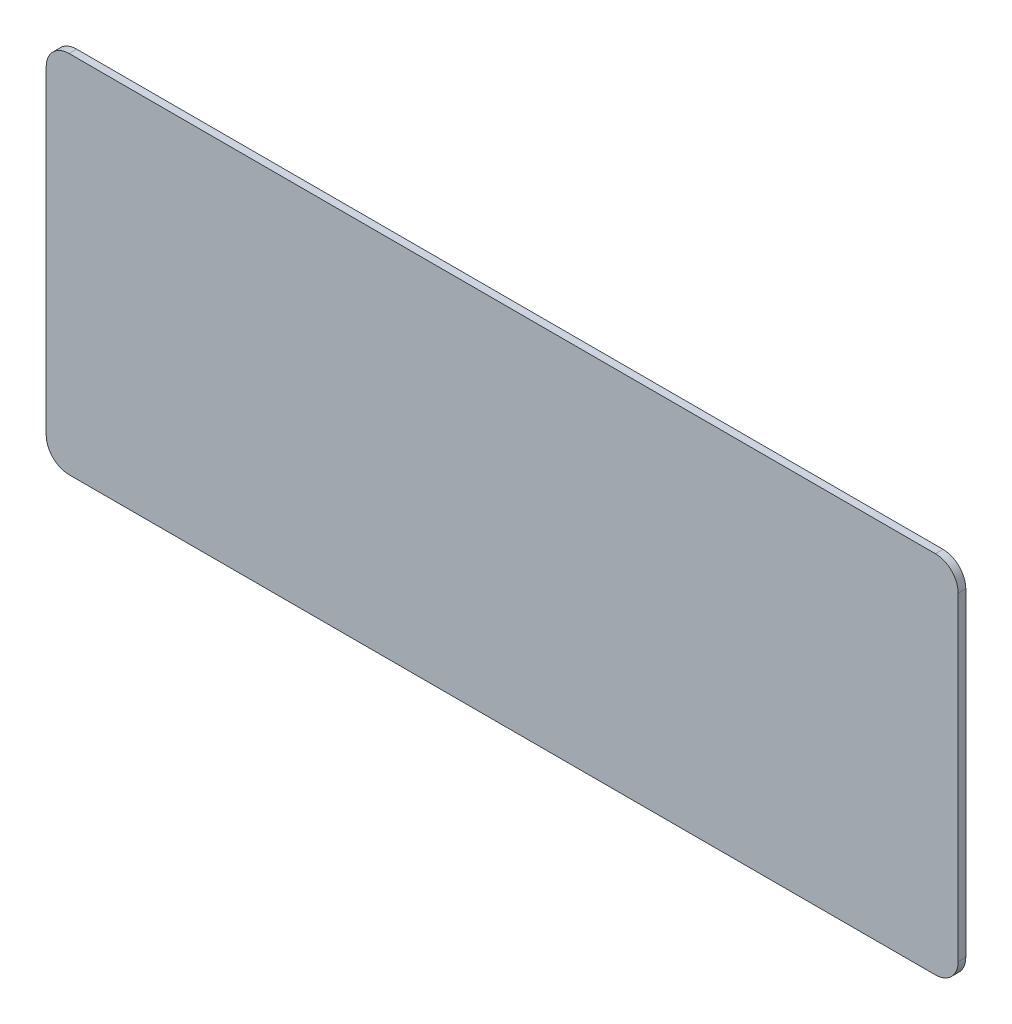
ISO-10303-21;
HEADER;
FILE_DESCRIPTION(('STEP AP214'),'2;1');
FILE_NAME('part.step','',(''),(''),'','','');
FILE_SCHEMA(('AUTOMOTIVE_DESIGN { 1 0 10303 214 1 1 1 1 }'));
ENDSEC;
DATA;
#1=APPLICATION_CONTEXT('core data for automotive mechanical design processes');
#2=APPLICATION_PROTOCOL_DEFINITION('international standard','automotive_design',2000,#1);
#3=PRODUCT_CONTEXT('',#1,'mechanical');
#4=PRODUCT('Part','Part','',(#3));
#5=PRODUCT_RELATED_PRODUCT_CATEGORY('part','',(#4));
#6=PRODUCT_DEFINITION_FORMATION('','',#4);
#7=PRODUCT_DEFINITION_CONTEXT('part definition',#1,'design');
#8=PRODUCT_DEFINITION('design','',#6,#7);
#9=PRODUCT_DEFINITION_SHAPE('','',#8);
#10=(LENGTH_UNIT() NAMED_UNIT(*) SI_UNIT(.MILLI.,.METRE.));
#11=(NAMED_UNIT(*) PLANE_ANGLE_UNIT() SI_UNIT($,.RADIAN.));
#12=(NAMED_UNIT(*) SI_UNIT($,.STERADIAN.) SOLID_ANGLE_UNIT());
#13=UNCERTAINTY_MEASURE_WITH_UNIT(LENGTH_MEASURE(1.E-05),#10,'distance_accuracy_value','');
#14=(GEOMETRIC_REPRESENTATION_CONTEXT(3) GLOBAL_UNCERTAINTY_ASSIGNED_CONTEXT((#13)) GLOBAL_UNIT_ASSIGNED_CONTEXT((#10,
#11,#12)) REPRESENTATION_CONTEXT('',''));
#15=CARTESIAN_POINT('',(0.,0.,0.));
#16=DIRECTION('',(0.,0.,1.));
#17=DIRECTION('',(1.,0.,0.));
#18=AXIS2_PLACEMENT_3D('',#15,#16,#17);
#19=CARTESIAN_POINT('',(-51.9401445531972,-20.8055695293981,1.));
#20=DIRECTION('',(0.,0.,-1.));
#21=DIRECTION('',(-1.,0.,0.));
#22=AXIS2_PLACEMENT_3D('',#19,#20,#21);
#23=CYLINDRICAL_SURFACE('',#22,3.);
#24=CARTESIAN_POINT('',(-51.9401445531972,-20.8055695293981,0.));
#25=DIRECTION('',(0.,0.,1.));
#26=DIRECTION('',(1.,0.,0.));
#27=AXIS2_PLACEMENT_3D('',#24,#25,#26);
#28=CIRCLE('',#27,3.);
#29=CARTESIAN_POINT('',(-54.9401445531972,-20.8055695293981,0.));
#30=VERTEX_POINT('',#29);
#31=CARTESIAN_POINT('',(-51.9401445531972,-23.8055695293981,0.));
#32=VERTEX_POINT('',#31);
#33=EDGE_CURVE('E132',#30,#32,#28,.T.);
#34=ORIENTED_EDGE('',*,*,#33,.T.);
#35=DIRECTION('',(0.,0.,-1.));
#36=VECTOR('',#35,1.);
#37=CARTESIAN_POINT('',(-51.9401445531972,-23.8055695293981,1.));
#38=LINE('',#37,#36);
#39=CARTESIAN_POINT('',(-51.9401445531972,-23.8055695293981,1.));
#40=VERTEX_POINT('',#39);
#41=EDGE_CURVE('E11',#40,#32,#38,.T.);
#42=ORIENTED_EDGE('',*,*,#41,.F.);
#43=CARTESIAN_POINT('',(-51.9401445531972,-20.8055695293981,1.));
#44=DIRECTION('',(0.,0.,1.));
#45=DIRECTION('',(1.,0.,0.));
#46=AXIS2_PLACEMENT_3D('',#43,#44,#45);
#47=CIRCLE('',#46,3.);
#48=CARTESIAN_POINT('',(-54.9401445531972,-20.8055695293981,1.));
#49=VERTEX_POINT('',#48);
#50=EDGE_CURVE('E148',#49,#40,#47,.T.);
#51=ORIENTED_EDGE('',*,*,#50,.F.);
#52=DIRECTION('',(0.,0.,-1.));
#53=VECTOR('',#52,1.);
#54=CARTESIAN_POINT('',(-54.9401445531972,-20.8055695293981,1.));
#55=LINE('',#54,#53);
#56=EDGE_CURVE('E128',#49,#30,#55,.T.);
#57=ORIENTED_EDGE('',*,*,#56,.T.);
#58=EDGE_LOOP('',(#34,#42,#51,#57));
#59=FACE_BOUND('',#58,.T.);
#60=ADVANCED_FACE('F35',(#59),#23,.T.);
#61=CARTESIAN_POINT('',(-51.9401445531972,-23.8055695293981,1.));
#62=DIRECTION('',(0.,1.,0.));
#63=DIRECTION('',(0.,0.,1.));
#64=AXIS2_PLACEMENT_3D('',#61,#62,#63);
#65=PLANE('',#64);
#66=DIRECTION('',(1.,0.,0.));
#67=VECTOR('',#66,1.);
#68=CARTESIAN_POINT('',(-51.9401445531972,-23.8055695293981,0.));
#69=LINE('',#68,#67);
#70=CARTESIAN_POINT('',(62.0598554468028,-23.8055695293981,0.));
#71=VERTEX_POINT('',#70);
#72=EDGE_CURVE('E135',#32,#71,#69,.T.);
#73=ORIENTED_EDGE('',*,*,#72,.T.);
#74=DIRECTION('',(0.,0.,-1.));
#75=VECTOR('',#74,1.);
#76=CARTESIAN_POINT('',(62.0598554468028,-23.8055695293981,1.));
#77=LINE('',#76,#75);
#78=CARTESIAN_POINT('',(62.0598554468028,-23.8055695293981,1.));
#79=VERTEX_POINT('',#78);
#80=EDGE_CURVE('E43',#79,#71,#77,.T.);
#81=ORIENTED_EDGE('',*,*,#80,.F.);
#82=DIRECTION('',(1.,0.,0.));
#83=VECTOR('',#82,1.);
#84=CARTESIAN_POINT('',(-51.9401445531972,-23.8055695293981,1.));
#85=LINE('',#84,#83);
#86=EDGE_CURVE('E92',#40,#79,#85,.T.);
#87=ORIENTED_EDGE('',*,*,#86,.F.);
#88=ORIENTED_EDGE('',*,*,#41,.T.);
#89=EDGE_LOOP('',(#73,#81,#87,#88));
#90=FACE_BOUND('',#89,.T.);
#91=ADVANCED_FACE('F180',(#90),#65,.F.);
#92=CARTESIAN_POINT('',(62.0598554468028,-20.8055695293981,1.));
#93=DIRECTION('',(0.,0.,-1.));
#94=DIRECTION('',(-1.,0.,0.));
#95=AXIS2_PLACEMENT_3D('',#92,#93,#94);
#96=CYLINDRICAL_SURFACE('',#95,3.);
#97=CARTESIAN_POINT('',(62.0598554468028,-20.8055695293981,0.));
#98=DIRECTION('',(0.,0.,1.));
#99=DIRECTION('',(1.,0.,0.));
#100=AXIS2_PLACEMENT_3D('',#97,#98,#99);
#101=CIRCLE('',#100,3.);
#102=CARTESIAN_POINT('',(65.0598554468028,-20.8055695293981,0.));
#103=VERTEX_POINT('',#102);
#104=EDGE_CURVE('E137',#71,#103,#101,.T.);
#105=ORIENTED_EDGE('',*,*,#104,.T.);
#106=DIRECTION('',(0.,0.,-1.));
#107=VECTOR('',#106,1.);
#108=CARTESIAN_POINT('',(65.0598554468028,-20.8055695293981,1.));
#109=LINE('',#108,#107);
#110=CARTESIAN_POINT('',(65.0598554468028,-20.8055695293981,1.));
#111=VERTEX_POINT('',#110);
#112=EDGE_CURVE('E155',#111,#103,#109,.T.);
#113=ORIENTED_EDGE('',*,*,#112,.F.);
#114=CARTESIAN_POINT('',(62.0598554468028,-20.8055695293981,1.));
#115=DIRECTION('',(0.,0.,1.));
#116=DIRECTION('',(1.,0.,0.));
#117=AXIS2_PLACEMENT_3D('',#114,#115,#116);
#118=CIRCLE('',#117,3.);
#119=EDGE_CURVE('E163',#79,#111,#118,.T.);
#120=ORIENTED_EDGE('',*,*,#119,.F.);
#121=ORIENTED_EDGE('',*,*,#80,.T.);
#122=EDGE_LOOP('',(#105,#113,#120,#121));
#123=FACE_BOUND('',#122,.T.);
#124=ADVANCED_FACE('F161',(#123),#96,.T.);
#125=CARTESIAN_POINT('',(65.0598554468031,0.194430470601938,1.));
#126=DIRECTION('',(-1.,0.,0.));
#127=DIRECTION('',(0.,-1.,0.));
#128=AXIS2_PLACEMENT_3D('',#125,#126,#127);
#129=PLANE('',#128);
#130=DIRECTION('',(0.,1.,0.));
#131=VECTOR('',#130,1.);
#132=CARTESIAN_POINT('',(65.0598554468031,0.194430470601938,0.));
#133=LINE('',#132,#131);
#134=CARTESIAN_POINT('',(65.0598554468028,21.1944304706019,0.));
#135=VERTEX_POINT('',#134);
#136=EDGE_CURVE('E140',#103,#135,#133,.T.);
#137=ORIENTED_EDGE('',*,*,#136,.T.);
#138=DIRECTION('',(0.,0.,-1.));
#139=VECTOR('',#138,1.);
#140=CARTESIAN_POINT('',(65.0598554468028,21.1944304706019,1.));
#141=LINE('',#140,#139);
#142=CARTESIAN_POINT('',(65.0598554468028,21.1944304706019,1.));
#143=VERTEX_POINT('',#142);
#144=EDGE_CURVE('E152',#143,#135,#141,.T.);
#145=ORIENTED_EDGE('',*,*,#144,.F.);
#146=DIRECTION('',(0.,1.,0.));
#147=VECTOR('',#146,1.);
#148=CARTESIAN_POINT('',(65.0598554468028,-20.8055695293981,1.));
#149=LINE('',#148,#147);
#150=EDGE_CURVE('E172',#111,#143,#149,.T.);
#151=ORIENTED_EDGE('',*,*,#150,.F.);
#152=ORIENTED_EDGE('',*,*,#112,.T.);
#153=EDGE_LOOP('',(#137,#145,#151,#152));
#154=FACE_BOUND('',#153,.T.);
#155=ADVANCED_FACE('F168',(#154),#129,.F.);
#156=CARTESIAN_POINT('',(62.0598554468028,21.1944304706019,1.));
#157=DIRECTION('',(0.,0.,-1.));
#158=DIRECTION('',(-1.,0.,0.));
#159=AXIS2_PLACEMENT_3D('',#156,#157,#158);
#160=CYLINDRICAL_SURFACE('',#159,3.);
#161=CARTESIAN_POINT('',(62.0598554468028,21.1944304706019,0.));
#162=DIRECTION('',(0.,0.,1.));
#163=DIRECTION('',(1.,0.,0.));
#164=AXIS2_PLACEMENT_3D('',#161,#162,#163);
#165=CIRCLE('',#164,3.);
#166=CARTESIAN_POINT('',(62.0598554468028,24.1944304706019,0.));
#167=VERTEX_POINT('',#166);
#168=EDGE_CURVE('E142',#135,#167,#165,.T.);
#169=ORIENTED_EDGE('',*,*,#168,.T.);
#170=DIRECTION('',(0.,0.,-1.));
#171=VECTOR('',#170,1.);
#172=CARTESIAN_POINT('',(62.0598554468028,24.1944304706019,1.));
#173=LINE('',#172,#171);
#174=CARTESIAN_POINT('',(62.0598554468028,24.1944304706019,1.));
#175=VERTEX_POINT('',#174);
#176=EDGE_CURVE('E123',#175,#167,#173,.T.);
#177=ORIENTED_EDGE('',*,*,#176,.F.);
#178=CARTESIAN_POINT('',(62.0598554468028,21.1944304706019,1.));
#179=DIRECTION('',(0.,0.,1.));
#180=DIRECTION('',(1.,0.,0.));
#181=AXIS2_PLACEMENT_3D('',#178,#179,#180);
#182=CIRCLE('',#181,3.);
#183=EDGE_CURVE('E112',#143,#175,#182,.T.);
#184=ORIENTED_EDGE('',*,*,#183,.F.);
#185=ORIENTED_EDGE('',*,*,#144,.T.);
#186=EDGE_LOOP('',(#169,#177,#184,#185));
#187=FACE_BOUND('',#186,.T.);
#188=ADVANCED_FACE('F171',(#187),#160,.T.);
#189=CARTESIAN_POINT('',(62.0598554468028,24.1944304706019,1.));
#190=DIRECTION('',(0.,-1.,0.));
#191=DIRECTION('',(0.,0.,-1.));
#192=AXIS2_PLACEMENT_3D('',#189,#190,#191);
#193=PLANE('',#192);
#194=DIRECTION('',(-1.,0.,0.));
#195=VECTOR('',#194,1.);
#196=CARTESIAN_POINT('',(62.0598554468028,24.1944304706019,0.));
#197=LINE('',#196,#195);
#198=CARTESIAN_POINT('',(-51.9401445531972,24.1944304706019,0.));
#199=VERTEX_POINT('',#198);
#200=EDGE_CURVE('E121',#167,#199,#197,.T.);
#201=ORIENTED_EDGE('',*,*,#200,.T.);
#202=DIRECTION('',(0.,0.,-1.));
#203=VECTOR('',#202,1.);
#204=CARTESIAN_POINT('',(-51.9401445531972,24.1944304706019,1.));
#205=LINE('',#204,#203);
#206=CARTESIAN_POINT('',(-51.9401445531972,24.1944304706019,1.));
#207=VERTEX_POINT('',#206);
#208=EDGE_CURVE('E118',#207,#199,#205,.T.);
#209=ORIENTED_EDGE('',*,*,#208,.F.);
#210=DIRECTION('',(-1.,0.,0.));
#211=VECTOR('',#210,1.);
#212=CARTESIAN_POINT('',(62.0598554468028,24.1944304706019,1.));
#213=LINE('',#212,#211);
#214=EDGE_CURVE('E105',#175,#207,#213,.T.);
#215=ORIENTED_EDGE('',*,*,#214,.F.);
#216=ORIENTED_EDGE('',*,*,#176,.T.);
#217=EDGE_LOOP('',(#201,#209,#215,#216));
#218=FACE_BOUND('',#217,.T.);
#219=ADVANCED_FACE('F119',(#218),#193,.F.);
#220=CARTESIAN_POINT('',(-51.9401445531972,21.1944304706019,1.));
#221=DIRECTION('',(0.,0.,-1.));
#222=DIRECTION('',(-1.,0.,0.));
#223=AXIS2_PLACEMENT_3D('',#220,#221,#222);
#224=CYLINDRICAL_SURFACE('',#223,3.);
#225=CARTESIAN_POINT('',(-51.9401445531972,21.1944304706019,0.));
#226=DIRECTION('',(0.,0.,1.));
#227=DIRECTION('',(1.,0.,0.));
#228=AXIS2_PLACEMENT_3D('',#225,#226,#227);
#229=CIRCLE('',#228,3.);
#230=CARTESIAN_POINT('',(-54.9401445531972,21.1944304706019,0.));
#231=VERTEX_POINT('',#230);
#232=EDGE_CURVE('E145',#199,#231,#229,.T.);
#233=ORIENTED_EDGE('',*,*,#232,.T.);
#234=DIRECTION('',(0.,0.,-1.));
#235=VECTOR('',#234,1.);
#236=CARTESIAN_POINT('',(-54.9401445531972,21.1944304706019,1.));
#237=LINE('',#236,#235);
#238=CARTESIAN_POINT('',(-54.9401445531972,21.1944304706019,1.));
#239=VERTEX_POINT('',#238);
#240=EDGE_CURVE('E124',#239,#231,#237,.T.);
#241=ORIENTED_EDGE('',*,*,#240,.F.);
#242=CARTESIAN_POINT('',(-51.9401445531972,21.1944304706019,1.));
#243=DIRECTION('',(0.,0.,1.));
#244=DIRECTION('',(1.,0.,0.));
#245=AXIS2_PLACEMENT_3D('',#242,#243,#244);
#246=CIRCLE('',#245,3.);
#247=EDGE_CURVE('E109',#207,#239,#246,.T.);
#248=ORIENTED_EDGE('',*,*,#247,.F.);
#249=ORIENTED_EDGE('',*,*,#208,.T.);
#250=EDGE_LOOP('',(#233,#241,#248,#249));
#251=FACE_BOUND('',#250,.T.);
#252=ADVANCED_FACE('F126',(#251),#224,.T.);
#253=CARTESIAN_POINT('',(-54.9401445531972,0.194430470601938,1.));
#254=DIRECTION('',(1.,0.,0.));
#255=DIRECTION('',(0.,1.,0.));
#256=AXIS2_PLACEMENT_3D('',#253,#254,#255);
#257=PLANE('',#256);
#258=DIRECTION('',(0.,-1.,0.));
#259=VECTOR('',#258,1.);
#260=CARTESIAN_POINT('',(-54.9401445531972,0.194430470601938,0.));
#261=LINE('',#260,#259);
#262=EDGE_CURVE('E80',#231,#30,#261,.T.);
#263=ORIENTED_EDGE('',*,*,#262,.T.);
#264=ORIENTED_EDGE('',*,*,#56,.F.);
#265=DIRECTION('',(0.,-1.,0.));
#266=VECTOR('',#265,1.);
#267=CARTESIAN_POINT('',(-54.9401445531972,21.1944304706019,1.));
#268=LINE('',#267,#266);
#269=EDGE_CURVE('E51',#239,#49,#268,.T.);
#270=ORIENTED_EDGE('',*,*,#269,.F.);
#271=ORIENTED_EDGE('',*,*,#240,.T.);
#272=EDGE_LOOP('',(#263,#264,#270,#271));
#273=FACE_BOUND('',#272,.T.);
#274=ADVANCED_FACE('F196',(#273),#257,.F.);
#275=CARTESIAN_POINT('',(-51.9401445531972,-20.8055695293981,1.));
#276=DIRECTION('',(0.,0.,1.));
#277=DIRECTION('',(1.,0.,0.));
#278=AXIS2_PLACEMENT_3D('',#275,#276,#277);
#279=PLANE('',#278);
#280=ORIENTED_EDGE('',*,*,#50,.T.);
#281=ORIENTED_EDGE('',*,*,#86,.T.);
#282=ORIENTED_EDGE('',*,*,#119,.T.);
#283=ORIENTED_EDGE('',*,*,#150,.T.);
#284=ORIENTED_EDGE('',*,*,#183,.T.);
#285=ORIENTED_EDGE('',*,*,#214,.T.);
#286=ORIENTED_EDGE('',*,*,#247,.T.);
#287=ORIENTED_EDGE('',*,*,#269,.T.);
#288=EDGE_LOOP('',(#280,#281,#282,#283,#284,#285,#286,#287));
#289=FACE_BOUND('',#288,.T.);
#290=ADVANCED_FACE('F107',(#289),#279,.T.);
#291=CARTESIAN_POINT('',(-51.9401445531972,-20.8055695293981,0.));
#292=DIRECTION('',(0.,0.,1.));
#293=DIRECTION('',(1.,0.,0.));
#294=AXIS2_PLACEMENT_3D('',#291,#292,#293);
#295=PLANE('',#294);
#296=ORIENTED_EDGE('',*,*,#33,.F.);
#297=ORIENTED_EDGE('',*,*,#262,.F.);
#298=ORIENTED_EDGE('',*,*,#232,.F.);
#299=ORIENTED_EDGE('',*,*,#200,.F.);
#300=ORIENTED_EDGE('',*,*,#168,.F.);
#301=ORIENTED_EDGE('',*,*,#136,.F.);
#302=ORIENTED_EDGE('',*,*,#104,.F.);
#303=ORIENTED_EDGE('',*,*,#72,.F.);
#304=EDGE_LOOP('',(#296,#297,#298,#299,#300,#301,#302,#303));
#305=FACE_BOUND('',#304,.T.);
#306=ADVANCED_FACE('F164',(#305),#295,.F.);
#307=CLOSED_SHELL('',(#60,#91,#124,#155,#188,#219,#252,#274,#290,#306));
#308=MANIFOLD_SOLID_BREP('B2',#307);
#309=ADVANCED_BREP_SHAPE_REPRESENTATION('',(#18,#308),#14);
#310=SHAPE_DEFINITION_REPRESENTATION(#9,#309);
ENDSEC;
END-ISO-10303-21;
